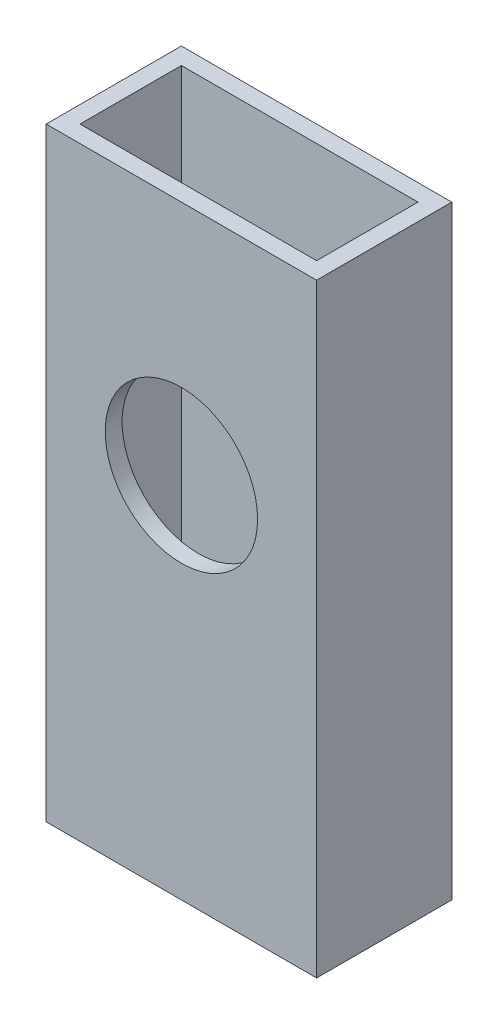
ISO-10303-21;
HEADER;
FILE_DESCRIPTION(('STEP AP214'),'2;1');
FILE_NAME('part.step','',(''),(''),'','','');
FILE_SCHEMA(('AUTOMOTIVE_DESIGN { 1 0 10303 214 1 1 1 1 }'));
ENDSEC;
DATA;
#1=APPLICATION_CONTEXT('core data for automotive mechanical design processes');
#2=APPLICATION_PROTOCOL_DEFINITION('international standard','automotive_design',2000,#1);
#3=PRODUCT_CONTEXT('',#1,'mechanical');
#4=PRODUCT('Part','Part','',(#3));
#5=PRODUCT_RELATED_PRODUCT_CATEGORY('part','',(#4));
#6=PRODUCT_DEFINITION_FORMATION('','',#4);
#7=PRODUCT_DEFINITION_CONTEXT('part definition',#1,'design');
#8=PRODUCT_DEFINITION('design','',#6,#7);
#9=PRODUCT_DEFINITION_SHAPE('','',#8);
#10=(LENGTH_UNIT() NAMED_UNIT(*) SI_UNIT(.MILLI.,.METRE.));
#11=(NAMED_UNIT(*) PLANE_ANGLE_UNIT() SI_UNIT($,.RADIAN.));
#12=(NAMED_UNIT(*) SI_UNIT($,.STERADIAN.) SOLID_ANGLE_UNIT());
#13=UNCERTAINTY_MEASURE_WITH_UNIT(LENGTH_MEASURE(1.E-05),#10,'distance_accuracy_value','');
#14=(GEOMETRIC_REPRESENTATION_CONTEXT(3) GLOBAL_UNCERTAINTY_ASSIGNED_CONTEXT((#13)) GLOBAL_UNIT_ASSIGNED_CONTEXT((#10,
#11,#12)) REPRESENTATION_CONTEXT('',''));
#15=CARTESIAN_POINT('',(0.,0.,0.));
#16=DIRECTION('',(0.,0.,1.));
#17=DIRECTION('',(1.,0.,0.));
#18=AXIS2_PLACEMENT_3D('',#15,#16,#17);
#19=CARTESIAN_POINT('',(-25.4,56.769,25.4));
#20=DIRECTION('',(0.,-1.,0.));
#21=DIRECTION('',(0.,0.,-1.));
#22=AXIS2_PLACEMENT_3D('',#19,#20,#21);
#23=PLANE('',#22);
#24=DIRECTION('',(-1.,0.,0.));
#25=VECTOR('',#24,1.);
#26=CARTESIAN_POINT('',(-25.4,56.769,0.));
#27=LINE('',#26,#25);
#28=CARTESIAN_POINT('',(25.4,56.769,0.));
#29=VERTEX_POINT('',#28);
#30=CARTESIAN_POINT('',(-25.4,56.769,0.));
#31=VERTEX_POINT('',#30);
#32=EDGE_CURVE('E150',#29,#31,#27,.T.);
#33=ORIENTED_EDGE('',*,*,#32,.T.);
#34=DIRECTION('',(0.,0.,-1.));
#35=VECTOR('',#34,1.);
#36=CARTESIAN_POINT('',(-25.4,56.769,25.4));
#37=LINE('',#36,#35);
#38=CARTESIAN_POINT('',(-25.4,56.769,25.4));
#39=VERTEX_POINT('',#38);
#40=EDGE_CURVE('E45',#39,#31,#37,.T.);
#41=ORIENTED_EDGE('',*,*,#40,.F.);
#42=DIRECTION('',(-1.,0.,0.));
#43=VECTOR('',#42,1.);
#44=CARTESIAN_POINT('',(-25.4,56.769,25.4));
#45=LINE('',#44,#43);
#46=CARTESIAN_POINT('',(25.4,56.769,25.4));
#47=VERTEX_POINT('',#46);
#48=EDGE_CURVE('E140',#47,#39,#45,.T.);
#49=ORIENTED_EDGE('',*,*,#48,.F.);
#50=DIRECTION('',(0.,0.,-1.));
#51=VECTOR('',#50,1.);
#52=CARTESIAN_POINT('',(25.4,56.769,25.4));
#53=LINE('',#52,#51);
#54=EDGE_CURVE('E11',#47,#29,#53,.T.);
#55=ORIENTED_EDGE('',*,*,#54,.T.);
#56=EDGE_LOOP('',(#33,#41,#49,#55));
#57=FACE_BOUND('',#56,.T.);
#58=DIRECTION('',(-1.,0.,0.));
#59=VECTOR('',#58,1.);
#60=CARTESIAN_POINT('',(-25.4,56.769,3.175));
#61=LINE('',#60,#59);
#62=CARTESIAN_POINT('',(22.225,56.769,3.175));
#63=VERTEX_POINT('',#62);
#64=CARTESIAN_POINT('',(-22.225,56.769,3.175));
#65=VERTEX_POINT('',#64);
#66=EDGE_CURVE('E115',#63,#65,#61,.T.);
#67=ORIENTED_EDGE('',*,*,#66,.F.);
#68=DIRECTION('',(0.,0.,-1.));
#69=VECTOR('',#68,1.);
#70=CARTESIAN_POINT('',(22.225,56.769,25.4));
#71=LINE('',#70,#69);
#72=CARTESIAN_POINT('',(22.225,56.769,22.225));
#73=VERTEX_POINT('',#72);
#74=EDGE_CURVE('E102',#73,#63,#71,.T.);
#75=ORIENTED_EDGE('',*,*,#74,.F.);
#76=DIRECTION('',(-1.,0.,0.));
#77=VECTOR('',#76,1.);
#78=CARTESIAN_POINT('',(-25.4,56.769,22.225));
#79=LINE('',#78,#77);
#80=CARTESIAN_POINT('',(-22.225,56.769,22.225));
#81=VERTEX_POINT('',#80);
#82=EDGE_CURVE('E128',#73,#81,#79,.T.);
#83=ORIENTED_EDGE('',*,*,#82,.T.);
#84=DIRECTION('',(0.,0.,-1.));
#85=VECTOR('',#84,1.);
#86=CARTESIAN_POINT('',(-22.225,56.769,25.4));
#87=LINE('',#86,#85);
#88=EDGE_CURVE('E111',#81,#65,#87,.T.);
#89=ORIENTED_EDGE('',*,*,#88,.T.);
#90=EDGE_LOOP('',(#67,#75,#83,#89));
#91=FACE_BOUND('',#90,.T.);
#92=ADVANCED_FACE('F36',(#57,#91),#23,.F.);
#93=CARTESIAN_POINT('',(-25.4,-56.769,25.4));
#94=DIRECTION('',(0.,1.,0.));
#95=DIRECTION('',(0.,0.,1.));
#96=AXIS2_PLACEMENT_3D('',#93,#94,#95);
#97=PLANE('',#96);
#98=DIRECTION('',(1.,0.,0.));
#99=VECTOR('',#98,1.);
#100=CARTESIAN_POINT('',(-25.4,-56.769,0.));
#101=LINE('',#100,#99);
#102=CARTESIAN_POINT('',(-25.4,-56.769,0.));
#103=VERTEX_POINT('',#102);
#104=CARTESIAN_POINT('',(25.4,-56.769,0.));
#105=VERTEX_POINT('',#104);
#106=EDGE_CURVE('E141',#103,#105,#101,.T.);
#107=ORIENTED_EDGE('',*,*,#106,.T.);
#108=DIRECTION('',(0.,0.,-1.));
#109=VECTOR('',#108,1.);
#110=CARTESIAN_POINT('',(25.4,-56.769,25.4));
#111=LINE('',#110,#109);
#112=CARTESIAN_POINT('',(25.4,-56.769,25.4));
#113=VERTEX_POINT('',#112);
#114=EDGE_CURVE('E147',#113,#105,#111,.T.);
#115=ORIENTED_EDGE('',*,*,#114,.F.);
#116=DIRECTION('',(1.,0.,0.));
#117=VECTOR('',#116,1.);
#118=CARTESIAN_POINT('',(-25.4,-56.769,25.4));
#119=LINE('',#118,#117);
#120=CARTESIAN_POINT('',(-25.4,-56.769,25.4));
#121=VERTEX_POINT('',#120);
#122=EDGE_CURVE('E145',#121,#113,#119,.T.);
#123=ORIENTED_EDGE('',*,*,#122,.F.);
#124=DIRECTION('',(0.,0.,-1.));
#125=VECTOR('',#124,1.);
#126=CARTESIAN_POINT('',(-25.4,-56.769,25.4));
#127=LINE('',#126,#125);
#128=EDGE_CURVE('E157',#121,#103,#127,.T.);
#129=ORIENTED_EDGE('',*,*,#128,.T.);
#130=EDGE_LOOP('',(#107,#115,#123,#129));
#131=FACE_BOUND('',#130,.T.);
#132=DIRECTION('',(1.,0.,0.));
#133=VECTOR('',#132,1.);
#134=CARTESIAN_POINT('',(-25.4,-56.769,3.175));
#135=LINE('',#134,#133);
#136=CARTESIAN_POINT('',(-22.225,-56.769,3.175));
#137=VERTEX_POINT('',#136);
#138=CARTESIAN_POINT('',(22.225,-56.769,3.175));
#139=VERTEX_POINT('',#138);
#140=EDGE_CURVE('E118',#137,#139,#135,.T.);
#141=ORIENTED_EDGE('',*,*,#140,.F.);
#142=DIRECTION('',(0.,0.,-1.));
#143=VECTOR('',#142,1.);
#144=CARTESIAN_POINT('',(-22.225,-56.769,25.4));
#145=LINE('',#144,#143);
#146=CARTESIAN_POINT('',(-22.225,-56.769,22.225));
#147=VERTEX_POINT('',#146);
#148=EDGE_CURVE('E127',#147,#137,#145,.T.);
#149=ORIENTED_EDGE('',*,*,#148,.F.);
#150=DIRECTION('',(1.,0.,0.));
#151=VECTOR('',#150,1.);
#152=CARTESIAN_POINT('',(-25.4,-56.769,22.225));
#153=LINE('',#152,#151);
#154=CARTESIAN_POINT('',(22.225,-56.769,22.225));
#155=VERTEX_POINT('',#154);
#156=EDGE_CURVE('E59',#147,#155,#153,.T.);
#157=ORIENTED_EDGE('',*,*,#156,.T.);
#158=DIRECTION('',(0.,0.,-1.));
#159=VECTOR('',#158,1.);
#160=CARTESIAN_POINT('',(22.225,-56.769,25.4));
#161=LINE('',#160,#159);
#162=EDGE_CURVE('E131',#155,#139,#161,.T.);
#163=ORIENTED_EDGE('',*,*,#162,.T.);
#164=EDGE_LOOP('',(#141,#149,#157,#163));
#165=FACE_BOUND('',#164,.T.);
#166=ADVANCED_FACE('F174',(#131,#165),#97,.F.);
#167=CARTESIAN_POINT('',(25.4,56.769,25.4));
#168=DIRECTION('',(-1.,0.,0.));
#169=DIRECTION('',(0.,-1.,0.));
#170=AXIS2_PLACEMENT_3D('',#167,#168,#169);
#171=PLANE('',#170);
#172=DIRECTION('',(0.,1.,0.));
#173=VECTOR('',#172,1.);
#174=CARTESIAN_POINT('',(25.4,56.769,0.));
#175=LINE('',#174,#173);
#176=EDGE_CURVE('E110',#105,#29,#175,.T.);
#177=ORIENTED_EDGE('',*,*,#176,.T.);
#178=ORIENTED_EDGE('',*,*,#54,.F.);
#179=DIRECTION('',(0.,1.,0.));
#180=VECTOR('',#179,1.);
#181=CARTESIAN_POINT('',(25.4,56.769,25.4));
#182=LINE('',#181,#180);
#183=EDGE_CURVE('E137',#113,#47,#182,.T.);
#184=ORIENTED_EDGE('',*,*,#183,.F.);
#185=ORIENTED_EDGE('',*,*,#114,.T.);
#186=EDGE_LOOP('',(#177,#178,#184,#185));
#187=FACE_BOUND('',#186,.T.);
#188=ADVANCED_FACE('F38',(#187),#171,.F.);
#189=CARTESIAN_POINT('',(-25.4,56.769,25.4));
#190=DIRECTION('',(1.,0.,0.));
#191=DIRECTION('',(0.,1.,0.));
#192=AXIS2_PLACEMENT_3D('',#189,#190,#191);
#193=PLANE('',#192);
#194=DIRECTION('',(0.,-1.,0.));
#195=VECTOR('',#194,1.);
#196=CARTESIAN_POINT('',(-25.4,56.769,0.));
#197=LINE('',#196,#195);
#198=EDGE_CURVE('E152',#31,#103,#197,.T.);
#199=ORIENTED_EDGE('',*,*,#198,.T.);
#200=ORIENTED_EDGE('',*,*,#128,.F.);
#201=DIRECTION('',(0.,-1.,0.));
#202=VECTOR('',#201,1.);
#203=CARTESIAN_POINT('',(-25.4,56.769,25.4));
#204=LINE('',#203,#202);
#205=EDGE_CURVE('E143',#39,#121,#204,.T.);
#206=ORIENTED_EDGE('',*,*,#205,.F.);
#207=ORIENTED_EDGE('',*,*,#40,.T.);
#208=EDGE_LOOP('',(#199,#200,#206,#207));
#209=FACE_BOUND('',#208,.T.);
#210=ADVANCED_FACE('F165',(#209),#193,.F.);
#211=CARTESIAN_POINT('',(0.,0.,25.4));
#212=DIRECTION('',(0.,0.,1.));
#213=DIRECTION('',(1.,0.,0.));
#214=AXIS2_PLACEMENT_3D('',#211,#212,#213);
#215=PLANE('',#214);
#216=CARTESIAN_POINT('',(0.,12.319,25.4));
#217=DIRECTION('',(0.,0.,1.));
#218=DIRECTION('',(1.,0.,0.));
#219=AXIS2_PLACEMENT_3D('',#216,#217,#218);
#220=CIRCLE('',#219,14.3129);
#221=CARTESIAN_POINT('',(14.3129,12.319,25.4));
#222=VERTEX_POINT('',#221);
#223=EDGE_CURVE('E223',#222,#222,#220,.T.);
#224=ORIENTED_EDGE('',*,*,#223,.F.);
#225=EDGE_LOOP('',(#224));
#226=FACE_BOUND('',#225,.T.);
#227=ORIENTED_EDGE('',*,*,#183,.T.);
#228=ORIENTED_EDGE('',*,*,#48,.T.);
#229=ORIENTED_EDGE('',*,*,#205,.T.);
#230=ORIENTED_EDGE('',*,*,#122,.T.);
#231=EDGE_LOOP('',(#227,#228,#229,#230));
#232=FACE_BOUND('',#231,.T.);
#233=ADVANCED_FACE('F181',(#226,#232),#215,.T.);
#234=CARTESIAN_POINT('',(0.,0.,0.));
#235=DIRECTION('',(0.,0.,1.));
#236=DIRECTION('',(1.,0.,0.));
#237=AXIS2_PLACEMENT_3D('',#234,#235,#236);
#238=PLANE('',#237);
#239=CARTESIAN_POINT('',(0.,12.319,0.));
#240=DIRECTION('',(0.,0.,1.));
#241=DIRECTION('',(1.,0.,0.));
#242=AXIS2_PLACEMENT_3D('',#239,#240,#241);
#243=CIRCLE('',#242,14.3129);
#244=CARTESIAN_POINT('',(14.3129,12.319,0.));
#245=VERTEX_POINT('',#244);
#246=EDGE_CURVE('E222',#245,#245,#243,.T.);
#247=ORIENTED_EDGE('',*,*,#246,.T.);
#248=EDGE_LOOP('',(#247));
#249=FACE_BOUND('',#248,.T.);
#250=ORIENTED_EDGE('',*,*,#176,.F.);
#251=ORIENTED_EDGE('',*,*,#106,.F.);
#252=ORIENTED_EDGE('',*,*,#198,.F.);
#253=ORIENTED_EDGE('',*,*,#32,.F.);
#254=EDGE_LOOP('',(#250,#251,#252,#253));
#255=FACE_BOUND('',#254,.T.);
#256=ADVANCED_FACE('F171',(#249,#255),#238,.F.);
#257=CARTESIAN_POINT('',(22.225,56.769,25.4));
#258=DIRECTION('',(-1.,0.,0.));
#259=DIRECTION('',(0.,-1.,0.));
#260=AXIS2_PLACEMENT_3D('',#257,#258,#259);
#261=PLANE('',#260);
#262=DIRECTION('',(0.,1.,0.));
#263=VECTOR('',#262,1.);
#264=CARTESIAN_POINT('',(22.225,56.769,3.175));
#265=LINE('',#264,#263);
#266=EDGE_CURVE('E105',#139,#63,#265,.T.);
#267=ORIENTED_EDGE('',*,*,#266,.F.);
#268=ORIENTED_EDGE('',*,*,#162,.F.);
#269=DIRECTION('',(0.,1.,0.));
#270=VECTOR('',#269,1.);
#271=CARTESIAN_POINT('',(22.225,56.769,22.225));
#272=LINE('',#271,#270);
#273=EDGE_CURVE('E52',#155,#73,#272,.T.);
#274=ORIENTED_EDGE('',*,*,#273,.T.);
#275=ORIENTED_EDGE('',*,*,#74,.T.);
#276=EDGE_LOOP('',(#267,#268,#274,#275));
#277=FACE_BOUND('',#276,.T.);
#278=ADVANCED_FACE('F104',(#277),#261,.T.);
#279=CARTESIAN_POINT('',(-22.225,56.769,25.4));
#280=DIRECTION('',(1.,0.,0.));
#281=DIRECTION('',(0.,1.,0.));
#282=AXIS2_PLACEMENT_3D('',#279,#280,#281);
#283=PLANE('',#282);
#284=DIRECTION('',(0.,-1.,0.));
#285=VECTOR('',#284,1.);
#286=CARTESIAN_POINT('',(-22.225,56.769,3.175));
#287=LINE('',#286,#285);
#288=EDGE_CURVE('E122',#65,#137,#287,.T.);
#289=ORIENTED_EDGE('',*,*,#288,.F.);
#290=ORIENTED_EDGE('',*,*,#88,.F.);
#291=DIRECTION('',(0.,-1.,0.));
#292=VECTOR('',#291,1.);
#293=CARTESIAN_POINT('',(-22.225,56.769,22.225));
#294=LINE('',#293,#292);
#295=EDGE_CURVE('E130',#81,#147,#294,.T.);
#296=ORIENTED_EDGE('',*,*,#295,.T.);
#297=ORIENTED_EDGE('',*,*,#148,.T.);
#298=EDGE_LOOP('',(#289,#290,#296,#297));
#299=FACE_BOUND('',#298,.T.);
#300=ADVANCED_FACE('F203',(#299),#283,.T.);
#301=CARTESIAN_POINT('',(0.,0.,22.225));
#302=DIRECTION('',(0.,0.,1.));
#303=DIRECTION('',(1.,0.,0.));
#304=AXIS2_PLACEMENT_3D('',#301,#302,#303);
#305=PLANE('',#304);
#306=CARTESIAN_POINT('',(0.,12.319,22.225));
#307=DIRECTION('',(0.,0.,1.));
#308=DIRECTION('',(1.,0.,0.));
#309=AXIS2_PLACEMENT_3D('',#306,#307,#308);
#310=CIRCLE('',#309,14.3129);
#311=CARTESIAN_POINT('',(14.3129,12.319,22.225));
#312=VERTEX_POINT('',#311);
#313=EDGE_CURVE('E119',#312,#312,#310,.T.);
#314=ORIENTED_EDGE('',*,*,#313,.T.);
#315=EDGE_LOOP('',(#314));
#316=FACE_BOUND('',#315,.T.);
#317=ORIENTED_EDGE('',*,*,#273,.F.);
#318=ORIENTED_EDGE('',*,*,#156,.F.);
#319=ORIENTED_EDGE('',*,*,#295,.F.);
#320=ORIENTED_EDGE('',*,*,#82,.F.);
#321=EDGE_LOOP('',(#317,#318,#319,#320));
#322=FACE_BOUND('',#321,.T.);
#323=ADVANCED_FACE('F199',(#316,#322),#305,.F.);
#324=CARTESIAN_POINT('',(0.,0.,3.175));
#325=DIRECTION('',(0.,0.,1.));
#326=DIRECTION('',(1.,0.,0.));
#327=AXIS2_PLACEMENT_3D('',#324,#325,#326);
#328=PLANE('',#327);
#329=CARTESIAN_POINT('',(0.,12.319,3.175));
#330=DIRECTION('',(0.,0.,1.));
#331=DIRECTION('',(1.,0.,0.));
#332=AXIS2_PLACEMENT_3D('',#329,#330,#331);
#333=CIRCLE('',#332,14.3129);
#334=CARTESIAN_POINT('',(14.3129,12.319,3.175));
#335=VERTEX_POINT('',#334);
#336=EDGE_CURVE('E40',#335,#335,#333,.T.);
#337=ORIENTED_EDGE('',*,*,#336,.F.);
#338=EDGE_LOOP('',(#337));
#339=FACE_BOUND('',#338,.T.);
#340=ORIENTED_EDGE('',*,*,#266,.T.);
#341=ORIENTED_EDGE('',*,*,#66,.T.);
#342=ORIENTED_EDGE('',*,*,#288,.T.);
#343=ORIENTED_EDGE('',*,*,#140,.T.);
#344=EDGE_LOOP('',(#340,#341,#342,#343));
#345=FACE_BOUND('',#344,.T.);
#346=ADVANCED_FACE('F114',(#339,#345),#328,.T.);
#347=CARTESIAN_POINT('',(0.,12.319,0.));
#348=DIRECTION('',(0.,0.,1.));
#349=DIRECTION('',(1.,0.,0.));
#350=AXIS2_PLACEMENT_3D('',#347,#348,#349);
#351=CYLINDRICAL_SURFACE('',#350,14.3129);
#352=ORIENTED_EDGE('',*,*,#336,.T.);
#353=EDGE_LOOP('',(#352));
#354=FACE_BOUND('',#353,.T.);
#355=ORIENTED_EDGE('',*,*,#246,.F.);
#356=EDGE_LOOP('',(#355));
#357=FACE_BOUND('',#356,.T.);
#358=ADVANCED_FACE('F198',(#354,#357),#351,.F.);
#359=ORIENTED_EDGE('',*,*,#223,.T.);
#360=EDGE_LOOP('',(#359));
#361=FACE_BOUND('',#360,.T.);
#362=ORIENTED_EDGE('',*,*,#313,.F.);
#363=EDGE_LOOP('',(#362));
#364=FACE_BOUND('',#363,.T.);
#365=ADVANCED_FACE('F211',(#361,#364),#351,.F.);
#366=CLOSED_SHELL('',(#92,#166,#188,#210,#233,#256,#278,#300,#323,#346,#358,#365));
#367=MANIFOLD_SOLID_BREP('B2',#366);
#368=ADVANCED_BREP_SHAPE_REPRESENTATION('',(#18,#367),#14);
#369=SHAPE_DEFINITION_REPRESENTATION(#9,#368);
ENDSEC;
END-ISO-10303-21;
